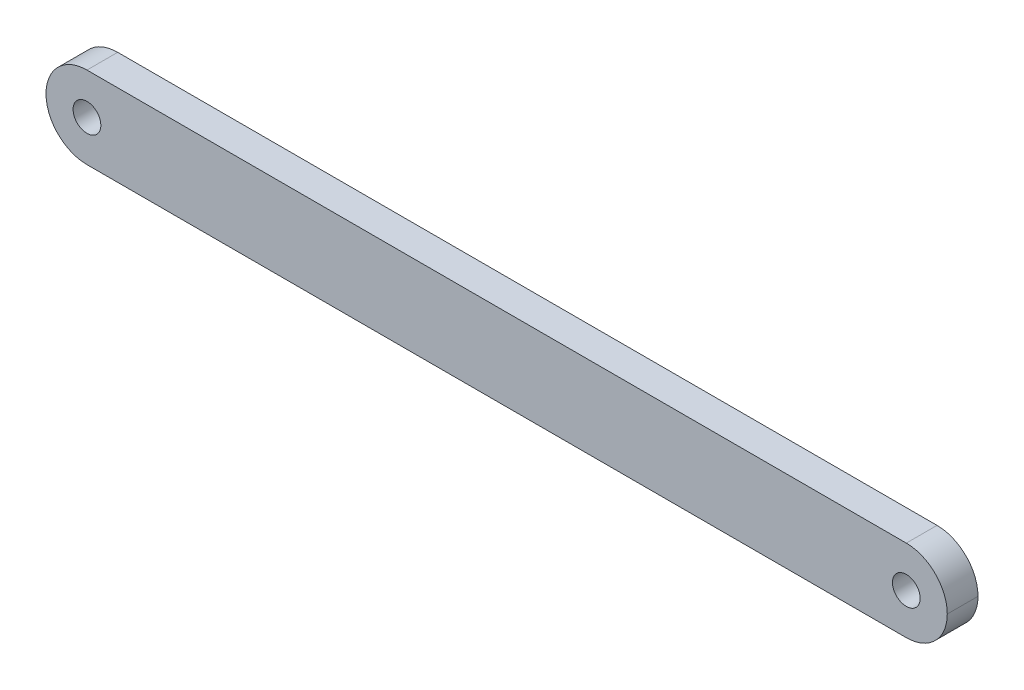
ISO-10303-21;
HEADER;
FILE_DESCRIPTION(('STEP AP214'),'2;1');
FILE_NAME('part.step','',(''),(''),'','','');
FILE_SCHEMA(('AUTOMOTIVE_DESIGN { 1 0 10303 214 1 1 1 1 }'));
ENDSEC;
DATA;
#1=APPLICATION_CONTEXT('core data for automotive mechanical design processes');
#2=APPLICATION_PROTOCOL_DEFINITION('international standard','automotive_design',2000,#1);
#3=PRODUCT_CONTEXT('',#1,'mechanical');
#4=PRODUCT('Part','Part','',(#3));
#5=PRODUCT_RELATED_PRODUCT_CATEGORY('part','',(#4));
#6=PRODUCT_DEFINITION_FORMATION('','',#4);
#7=PRODUCT_DEFINITION_CONTEXT('part definition',#1,'design');
#8=PRODUCT_DEFINITION('design','',#6,#7);
#9=PRODUCT_DEFINITION_SHAPE('','',#8);
#10=(LENGTH_UNIT() NAMED_UNIT(*) SI_UNIT(.MILLI.,.METRE.));
#11=(NAMED_UNIT(*) PLANE_ANGLE_UNIT() SI_UNIT($,.RADIAN.));
#12=(NAMED_UNIT(*) SI_UNIT($,.STERADIAN.) SOLID_ANGLE_UNIT());
#13=UNCERTAINTY_MEASURE_WITH_UNIT(LENGTH_MEASURE(1.E-05),#10,'distance_accuracy_value','');
#14=(GEOMETRIC_REPRESENTATION_CONTEXT(3) GLOBAL_UNCERTAINTY_ASSIGNED_CONTEXT((#13)) GLOBAL_UNIT_ASSIGNED_CONTEXT((#10,
#11,#12)) REPRESENTATION_CONTEXT('',''));
#15=CARTESIAN_POINT('',(0.,0.,0.));
#16=DIRECTION('',(0.,0.,1.));
#17=DIRECTION('',(1.,0.,0.));
#18=AXIS2_PLACEMENT_3D('',#15,#16,#17);
#19=CARTESIAN_POINT('',(55.8602220991314,3.999,3.));
#20=DIRECTION('',(0.,0.,-1.));
#21=DIRECTION('',(-1.,0.,0.));
#22=AXIS2_PLACEMENT_3D('',#19,#20,#21);
#23=CYLINDRICAL_SURFACE('',#22,4.);
#24=CARTESIAN_POINT('',(55.8602220991314,3.999,0.));
#25=DIRECTION('',(0.,0.,-1.));
#26=DIRECTION('',(-1.,0.,0.));
#27=AXIS2_PLACEMENT_3D('',#24,#25,#26);
#28=CIRCLE('',#27,4.);
#29=CARTESIAN_POINT('',(55.8602220991314,7.999,0.));
#30=VERTEX_POINT('',#29);
#31=CARTESIAN_POINT('',(59.8602219741314,3.99999999998902,0.));
#32=VERTEX_POINT('',#31);
#33=EDGE_CURVE('E122',#30,#32,#28,.T.);
#34=ORIENTED_EDGE('',*,*,#33,.F.);
#35=DIRECTION('',(0.,0.,-1.));
#36=VECTOR('',#35,1.);
#37=CARTESIAN_POINT('',(55.8602220991314,7.999,3.));
#38=LINE('',#37,#36);
#39=CARTESIAN_POINT('',(55.8602220991314,7.999,3.));
#40=VERTEX_POINT('',#39);
#41=EDGE_CURVE('E11',#40,#30,#38,.T.);
#42=ORIENTED_EDGE('',*,*,#41,.F.);
#43=CARTESIAN_POINT('',(55.8602220991314,3.999,3.));
#44=DIRECTION('',(0.,0.,-1.));
#45=DIRECTION('',(-1.,0.,0.));
#46=AXIS2_PLACEMENT_3D('',#43,#44,#45);
#47=CIRCLE('',#46,4.);
#48=CARTESIAN_POINT('',(59.8602219741314,3.99999999998902,3.));
#49=VERTEX_POINT('',#48);
#50=EDGE_CURVE('E137',#40,#49,#47,.T.);
#51=ORIENTED_EDGE('',*,*,#50,.T.);
#52=DIRECTION('',(0.,0.,-1.));
#53=VECTOR('',#52,1.);
#54=CARTESIAN_POINT('',(59.8602219741314,3.99999999998902,3.));
#55=LINE('',#54,#53);
#56=EDGE_CURVE('E40',#49,#32,#55,.T.);
#57=ORIENTED_EDGE('',*,*,#56,.T.);
#58=EDGE_LOOP('',(#34,#42,#51,#57));
#59=FACE_BOUND('',#58,.T.);
#60=ADVANCED_FACE('F37',(#59),#23,.T.);
#61=CARTESIAN_POINT('',(-24.1383205351164,7.999,3.));
#62=DIRECTION('',(0.,1.,0.));
#63=DIRECTION('',(0.,0.,1.));
#64=AXIS2_PLACEMENT_3D('',#61,#62,#63);
#65=PLANE('',#64);
#66=DIRECTION('',(1.,0.,0.));
#67=VECTOR('',#66,1.);
#68=CARTESIAN_POINT('',(-24.1383205351164,7.999,0.));
#69=LINE('',#68,#67);
#70=CARTESIAN_POINT('',(-24.1383205351164,7.999,0.));
#71=VERTEX_POINT('',#70);
#72=EDGE_CURVE('E135',#71,#30,#69,.T.);
#73=ORIENTED_EDGE('',*,*,#72,.F.);
#74=DIRECTION('',(0.,0.,-1.));
#75=VECTOR('',#74,1.);
#76=CARTESIAN_POINT('',(-24.1383205351164,7.999,3.));
#77=LINE('',#76,#75);
#78=CARTESIAN_POINT('',(-24.1383205351164,7.999,3.));
#79=VERTEX_POINT('',#78);
#80=EDGE_CURVE('E46',#79,#71,#77,.T.);
#81=ORIENTED_EDGE('',*,*,#80,.F.);
#82=DIRECTION('',(1.,0.,0.));
#83=VECTOR('',#82,1.);
#84=CARTESIAN_POINT('',(-24.1383205351164,7.999,3.));
#85=LINE('',#84,#83);
#86=EDGE_CURVE('E112',#79,#40,#85,.T.);
#87=ORIENTED_EDGE('',*,*,#86,.T.);
#88=ORIENTED_EDGE('',*,*,#41,.T.);
#89=EDGE_LOOP('',(#73,#81,#87,#88));
#90=FACE_BOUND('',#89,.T.);
#91=ADVANCED_FACE('F145',(#90),#65,.T.);
#92=CARTESIAN_POINT('',(-24.1383205351164,3.999,3.));
#93=DIRECTION('',(0.,0.,-1.));
#94=DIRECTION('',(-1.,0.,0.));
#95=AXIS2_PLACEMENT_3D('',#92,#93,#94);
#96=CYLINDRICAL_SURFACE('',#95,4.);
#97=CARTESIAN_POINT('',(-24.1383205351164,3.999,0.));
#98=DIRECTION('',(0.,0.,-1.));
#99=DIRECTION('',(-1.,0.,0.));
#100=AXIS2_PLACEMENT_3D('',#97,#98,#99);
#101=CIRCLE('',#100,4.);
#102=CARTESIAN_POINT('',(-28.1383205351164,3.99900000000404,0.));
#103=VERTEX_POINT('',#102);
#104=EDGE_CURVE('E99',#103,#71,#101,.T.);
#105=ORIENTED_EDGE('',*,*,#104,.F.);
#106=DIRECTION('',(0.,0.,-1.));
#107=VECTOR('',#106,1.);
#108=CARTESIAN_POINT('',(-28.1383205351164,3.99900000000404,3.));
#109=LINE('',#108,#107);
#110=CARTESIAN_POINT('',(-28.1383205351164,3.99900000000404,3.));
#111=VERTEX_POINT('',#110);
#112=EDGE_CURVE('E94',#111,#103,#109,.T.);
#113=ORIENTED_EDGE('',*,*,#112,.F.);
#114=CARTESIAN_POINT('',(-24.1383205351164,3.999,3.));
#115=DIRECTION('',(0.,0.,-1.));
#116=DIRECTION('',(-1.,0.,0.));
#117=AXIS2_PLACEMENT_3D('',#114,#115,#116);
#118=CIRCLE('',#117,4.);
#119=EDGE_CURVE('E97',#111,#79,#118,.T.);
#120=ORIENTED_EDGE('',*,*,#119,.T.);
#121=ORIENTED_EDGE('',*,*,#80,.T.);
#122=EDGE_LOOP('',(#105,#113,#120,#121));
#123=FACE_BOUND('',#122,.T.);
#124=ADVANCED_FACE('F96',(#123),#96,.T.);
#125=CARTESIAN_POINT('',(-24.1383206601164,4.,3.));
#126=DIRECTION('',(0.,0.,-1.));
#127=DIRECTION('',(-1.,0.,0.));
#128=AXIS2_PLACEMENT_3D('',#125,#126,#127);
#129=CYLINDRICAL_SURFACE('',#128,4.);
#130=CARTESIAN_POINT('',(-24.1383206601164,4.,0.));
#131=DIRECTION('',(0.,0.,-1.));
#132=DIRECTION('',(-1.,0.,0.));
#133=AXIS2_PLACEMENT_3D('',#130,#131,#132);
#134=CIRCLE('',#133,4.);
#135=CARTESIAN_POINT('',(-24.1383206601164,0.,0.));
#136=VERTEX_POINT('',#135);
#137=EDGE_CURVE('E132',#136,#103,#134,.T.);
#138=ORIENTED_EDGE('',*,*,#137,.F.);
#139=DIRECTION('',(0.,0.,-1.));
#140=VECTOR('',#139,1.);
#141=CARTESIAN_POINT('',(-24.1383206601164,0.,3.));
#142=LINE('',#141,#140);
#143=CARTESIAN_POINT('',(-24.1383206601164,0.,3.));
#144=VERTEX_POINT('',#143);
#145=EDGE_CURVE('E104',#144,#136,#142,.T.);
#146=ORIENTED_EDGE('',*,*,#145,.F.);
#147=CARTESIAN_POINT('',(-24.1383206601164,4.,3.));
#148=DIRECTION('',(0.,0.,-1.));
#149=DIRECTION('',(-1.,0.,0.));
#150=AXIS2_PLACEMENT_3D('',#147,#148,#149);
#151=CIRCLE('',#150,4.);
#152=EDGE_CURVE('E110',#144,#111,#151,.T.);
#153=ORIENTED_EDGE('',*,*,#152,.T.);
#154=ORIENTED_EDGE('',*,*,#112,.T.);
#155=EDGE_LOOP('',(#138,#146,#153,#154));
#156=FACE_BOUND('',#155,.T.);
#157=ADVANCED_FACE('F114',(#156),#129,.T.);
#158=CARTESIAN_POINT('',(55.8602219741314,0.,3.));
#159=DIRECTION('',(0.,-1.,0.));
#160=DIRECTION('',(0.,0.,-1.));
#161=AXIS2_PLACEMENT_3D('',#158,#159,#160);
#162=PLANE('',#161);
#163=DIRECTION('',(-1.,0.,0.));
#164=VECTOR('',#163,1.);
#165=CARTESIAN_POINT('',(55.8602219741314,0.,0.));
#166=LINE('',#165,#164);
#167=CARTESIAN_POINT('',(55.8602219741314,0.,0.));
#168=VERTEX_POINT('',#167);
#169=EDGE_CURVE('E129',#168,#136,#166,.T.);
#170=ORIENTED_EDGE('',*,*,#169,.F.);
#171=DIRECTION('',(0.,0.,-1.));
#172=VECTOR('',#171,1.);
#173=CARTESIAN_POINT('',(55.8602219741314,0.,3.));
#174=LINE('',#173,#172);
#175=CARTESIAN_POINT('',(55.8602219741314,0.,3.));
#176=VERTEX_POINT('',#175);
#177=EDGE_CURVE('E140',#176,#168,#174,.T.);
#178=ORIENTED_EDGE('',*,*,#177,.F.);
#179=DIRECTION('',(-1.,0.,0.));
#180=VECTOR('',#179,1.);
#181=CARTESIAN_POINT('',(55.8602219741314,0.,3.));
#182=LINE('',#181,#180);
#183=EDGE_CURVE('E115',#176,#144,#182,.T.);
#184=ORIENTED_EDGE('',*,*,#183,.T.);
#185=ORIENTED_EDGE('',*,*,#145,.T.);
#186=EDGE_LOOP('',(#170,#178,#184,#185));
#187=FACE_BOUND('',#186,.T.);
#188=ADVANCED_FACE('F158',(#187),#162,.T.);
#189=CARTESIAN_POINT('',(55.8602219741314,4.,3.));
#190=DIRECTION('',(0.,0.,-1.));
#191=DIRECTION('',(-1.,0.,0.));
#192=AXIS2_PLACEMENT_3D('',#189,#190,#191);
#193=CYLINDRICAL_SURFACE('',#192,4.);
#194=CARTESIAN_POINT('',(55.8602219741314,4.,0.));
#195=DIRECTION('',(0.,0.,-1.));
#196=DIRECTION('',(-1.,0.,0.));
#197=AXIS2_PLACEMENT_3D('',#194,#195,#196);
#198=CIRCLE('',#197,4.);
#199=EDGE_CURVE('E125',#32,#168,#198,.T.);
#200=ORIENTED_EDGE('',*,*,#199,.F.);
#201=ORIENTED_EDGE('',*,*,#56,.F.);
#202=CARTESIAN_POINT('',(55.8602219741314,4.,3.));
#203=DIRECTION('',(0.,0.,-1.));
#204=DIRECTION('',(-1.,0.,0.));
#205=AXIS2_PLACEMENT_3D('',#202,#203,#204);
#206=CIRCLE('',#205,4.);
#207=EDGE_CURVE('E117',#49,#176,#206,.T.);
#208=ORIENTED_EDGE('',*,*,#207,.T.);
#209=ORIENTED_EDGE('',*,*,#177,.T.);
#210=EDGE_LOOP('',(#200,#201,#208,#209));
#211=FACE_BOUND('',#210,.T.);
#212=ADVANCED_FACE('F142',(#211),#193,.T.);
#213=CARTESIAN_POINT('',(55.8602220991314,3.999,3.));
#214=DIRECTION('',(0.,0.,-1.));
#215=DIRECTION('',(-1.,0.,0.));
#216=AXIS2_PLACEMENT_3D('',#213,#214,#215);
#217=PLANE('',#216);
#218=CARTESIAN_POINT('',(55.8597335084298,3.99951153429841,3.));
#219=DIRECTION('',(0.,0.,-1.));
#220=DIRECTION('',(1.,0.,0.));
#221=AXIS2_PLACEMENT_3D('',#218,#219,#220);
#222=CIRCLE('',#221,1.35401050244143);
#223=CARTESIAN_POINT('',(54.5057230059884,3.99951153429841,3.));
#224=VERTEX_POINT('',#223);
#225=EDGE_CURVE('E184',#224,#224,#222,.T.);
#226=ORIENTED_EDGE('',*,*,#225,.T.);
#227=EDGE_LOOP('',(#226));
#228=FACE_BOUND('',#227,.T.);
#229=CARTESIAN_POINT('',(-24.138809000818,3.99851153429842,3.));
#230=DIRECTION('',(0.,0.,-1.));
#231=DIRECTION('',(1.,0.,0.));
#232=AXIS2_PLACEMENT_3D('',#229,#230,#231);
#233=CIRCLE('',#232,1.35401050244143);
#234=CARTESIAN_POINT('',(-25.4928195032594,3.99851153429842,3.));
#235=VERTEX_POINT('',#234);
#236=EDGE_CURVE('E126',#235,#235,#233,.T.);
#237=ORIENTED_EDGE('',*,*,#236,.T.);
#238=EDGE_LOOP('',(#237));
#239=FACE_BOUND('',#238,.T.);
#240=ORIENTED_EDGE('',*,*,#50,.F.);
#241=ORIENTED_EDGE('',*,*,#86,.F.);
#242=ORIENTED_EDGE('',*,*,#119,.F.);
#243=ORIENTED_EDGE('',*,*,#152,.F.);
#244=ORIENTED_EDGE('',*,*,#183,.F.);
#245=ORIENTED_EDGE('',*,*,#207,.F.);
#246=EDGE_LOOP('',(#240,#241,#242,#243,#244,#245));
#247=FACE_BOUND('',#246,.T.);
#248=ADVANCED_FACE('F108',(#228,#239,#247),#217,.F.);
#249=CARTESIAN_POINT('',(55.8602220991314,3.999,0.));
#250=DIRECTION('',(0.,0.,-1.));
#251=DIRECTION('',(-1.,0.,0.));
#252=AXIS2_PLACEMENT_3D('',#249,#250,#251);
#253=PLANE('',#252);
#254=CARTESIAN_POINT('',(55.8597335084298,3.99951153429841,0.));
#255=DIRECTION('',(0.,0.,-1.));
#256=DIRECTION('',(1.,0.,0.));
#257=AXIS2_PLACEMENT_3D('',#254,#255,#256);
#258=CIRCLE('',#257,1.35401050244143);
#259=CARTESIAN_POINT('',(54.5057230059884,3.99951153429841,0.));
#260=VERTEX_POINT('',#259);
#261=EDGE_CURVE('E187',#260,#260,#258,.T.);
#262=ORIENTED_EDGE('',*,*,#261,.F.);
#263=EDGE_LOOP('',(#262));
#264=FACE_BOUND('',#263,.T.);
#265=CARTESIAN_POINT('',(-24.138809000818,3.99851153429842,0.));
#266=DIRECTION('',(0.,0.,-1.));
#267=DIRECTION('',(1.,0.,0.));
#268=AXIS2_PLACEMENT_3D('',#265,#266,#267);
#269=CIRCLE('',#268,1.35401050244143);
#270=CARTESIAN_POINT('',(-25.4928195032594,3.99851153429842,0.));
#271=VERTEX_POINT('',#270);
#272=EDGE_CURVE('E189',#271,#271,#269,.T.);
#273=ORIENTED_EDGE('',*,*,#272,.F.);
#274=EDGE_LOOP('',(#273));
#275=FACE_BOUND('',#274,.T.);
#276=ORIENTED_EDGE('',*,*,#33,.T.);
#277=ORIENTED_EDGE('',*,*,#199,.T.);
#278=ORIENTED_EDGE('',*,*,#169,.T.);
#279=ORIENTED_EDGE('',*,*,#137,.T.);
#280=ORIENTED_EDGE('',*,*,#104,.T.);
#281=ORIENTED_EDGE('',*,*,#72,.T.);
#282=EDGE_LOOP('',(#276,#277,#278,#279,#280,#281));
#283=FACE_BOUND('',#282,.T.);
#284=ADVANCED_FACE('F144',(#264,#275,#283),#253,.T.);
#285=CARTESIAN_POINT('',(-24.138809000818,3.99851153429842,3.));
#286=DIRECTION('',(0.,0.,-1.));
#287=DIRECTION('',(-1.,0.,0.));
#288=AXIS2_PLACEMENT_3D('',#285,#286,#287);
#289=CYLINDRICAL_SURFACE('',#288,1.35401050244143);
#290=CARTESIAN_POINT('',(-25.4928195032594,3.99851153429842,3.));
#291=CARTESIAN_POINT('',(-25.4928195032594,3.99851153429842,2.96875));
#292=CARTESIAN_POINT('',(-25.4928195032594,3.99851153429842,2.9375));
#293=CARTESIAN_POINT('',(-25.4928195032594,3.99851153429842,2.875));
#294=CARTESIAN_POINT('',(-25.4928195032594,3.99851153429842,2.84375));
#295=CARTESIAN_POINT('',(-25.4928195032594,3.99851153429842,2.78125));
#296=CARTESIAN_POINT('',(-25.4928195032594,3.99851153429842,2.75));
#297=CARTESIAN_POINT('',(-25.4928195032594,3.99851153429842,2.6875));
#298=CARTESIAN_POINT('',(-25.4928195032594,3.99851153429842,2.65625));
#299=CARTESIAN_POINT('',(-25.4928195032594,3.99851153429842,2.59375));
#300=CARTESIAN_POINT('',(-25.4928195032594,3.99851153429842,2.5625));
#301=CARTESIAN_POINT('',(-25.4928195032594,3.99851153429842,2.5));
#302=CARTESIAN_POINT('',(-25.4928195032594,3.99851153429842,2.46875));
#303=CARTESIAN_POINT('',(-25.4928195032594,3.99851153429842,2.40625));
#304=CARTESIAN_POINT('',(-25.4928195032594,3.99851153429842,2.375));
#305=CARTESIAN_POINT('',(-25.4928195032594,3.99851153429842,2.3125));
#306=CARTESIAN_POINT('',(-25.4928195032594,3.99851153429842,2.28125));
#307=CARTESIAN_POINT('',(-25.4928195032594,3.99851153429842,2.21875));
#308=CARTESIAN_POINT('',(-25.4928195032594,3.99851153429842,2.1875));
#309=CARTESIAN_POINT('',(-25.4928195032594,3.99851153429842,2.125));
#310=CARTESIAN_POINT('',(-25.4928195032594,3.99851153429842,2.09375));
#311=CARTESIAN_POINT('',(-25.4928195032594,3.99851153429842,2.03125));
#312=CARTESIAN_POINT('',(-25.4928195032594,3.99851153429842,2.));
#313=CARTESIAN_POINT('',(-25.4928195032594,3.99851153429842,1.9375));
#314=CARTESIAN_POINT('',(-25.4928195032594,3.99851153429842,1.90625));
#315=CARTESIAN_POINT('',(-25.4928195032594,3.99851153429842,1.84375));
#316=CARTESIAN_POINT('',(-25.4928195032594,3.99851153429842,1.8125));
#317=CARTESIAN_POINT('',(-25.4928195032594,3.99851153429842,1.75));
#318=CARTESIAN_POINT('',(-25.4928195032594,3.99851153429842,1.71875));
#319=CARTESIAN_POINT('',(-25.4928195032594,3.99851153429842,1.65625));
#320=CARTESIAN_POINT('',(-25.4928195032594,3.99851153429842,1.625));
#321=CARTESIAN_POINT('',(-25.4928195032594,3.99851153429842,1.5625));
#322=CARTESIAN_POINT('',(-25.4928195032594,3.99851153429842,1.53125));
#323=CARTESIAN_POINT('',(-25.4928195032594,3.99851153429842,1.46875));
#324=CARTESIAN_POINT('',(-25.4928195032594,3.99851153429842,1.4375));
#325=CARTESIAN_POINT('',(-25.4928195032594,3.99851153429842,1.375));
#326=CARTESIAN_POINT('',(-25.4928195032594,3.99851153429842,1.34375));
#327=CARTESIAN_POINT('',(-25.4928195032594,3.99851153429842,1.28125));
#328=CARTESIAN_POINT('',(-25.4928195032594,3.99851153429842,1.25));
#329=CARTESIAN_POINT('',(-25.4928195032594,3.99851153429842,1.1875));
#330=CARTESIAN_POINT('',(-25.4928195032594,3.99851153429842,1.15625));
#331=CARTESIAN_POINT('',(-25.4928195032594,3.99851153429842,1.09375));
#332=CARTESIAN_POINT('',(-25.4928195032594,3.99851153429842,1.0625));
#333=CARTESIAN_POINT('',(-25.4928195032594,3.99851153429842,1.));
#334=CARTESIAN_POINT('',(-25.4928195032594,3.99851153429842,0.96875));
#335=CARTESIAN_POINT('',(-25.4928195032594,3.99851153429842,0.90625));
#336=CARTESIAN_POINT('',(-25.4928195032594,3.99851153429842,0.875));
#337=CARTESIAN_POINT('',(-25.4928195032594,3.99851153429842,0.8125));
#338=CARTESIAN_POINT('',(-25.4928195032594,3.99851153429842,0.78125));
#339=CARTESIAN_POINT('',(-25.4928195032594,3.99851153429842,0.71875));
#340=CARTESIAN_POINT('',(-25.4928195032594,3.99851153429842,0.6875));
#341=CARTESIAN_POINT('',(-25.4928195032594,3.99851153429842,0.625));
#342=CARTESIAN_POINT('',(-25.4928195032594,3.99851153429842,0.59375));
#343=CARTESIAN_POINT('',(-25.4928195032594,3.99851153429842,0.53125));
#344=CARTESIAN_POINT('',(-25.4928195032594,3.99851153429842,0.5));
#345=CARTESIAN_POINT('',(-25.4928195032594,3.99851153429842,0.4375));
#346=CARTESIAN_POINT('',(-25.4928195032594,3.99851153429842,0.40625));
#347=CARTESIAN_POINT('',(-25.4928195032594,3.99851153429842,0.34375));
#348=CARTESIAN_POINT('',(-25.4928195032594,3.99851153429842,0.3125));
#349=CARTESIAN_POINT('',(-25.4928195032594,3.99851153429842,0.25));
#350=CARTESIAN_POINT('',(-25.4928195032594,3.99851153429842,0.21875));
#351=CARTESIAN_POINT('',(-25.4928195032594,3.99851153429842,0.15625));
#352=CARTESIAN_POINT('',(-25.4928195032594,3.99851153429842,0.125));
#353=CARTESIAN_POINT('',(-25.4928195032594,3.99851153429842,0.0625000000000001));
#354=CARTESIAN_POINT('',(-25.4928195032594,3.99851153429842,0.03125));
#355=CARTESIAN_POINT('',(-25.4928195032594,3.99851153429842,0.));
#356=B_SPLINE_CURVE_WITH_KNOTS('',3,(#290,#291,#292,#293,#294,#295,#296,#297,#298,#299,#300,
#301,#302,#303,#304,#305,#306,#307,#308,#309,#310,#311,#312,#313,#314,#315,#316,#317,#318,#319,
#320,#321,#322,#323,#324,#325,#326,#327,#328,#329,#330,#331,#332,#333,#334,#335,#336,#337,#338,
#339,#340,#341,#342,#343,#344,#345,#346,#347,#348,#349,#350,#351,#352,#353,#354,#355),
.UNSPECIFIED.,.F.,.F.,(4,2,2,2,2,2,2,2,2,2,2,2,2,2,2,2,2,2,2,2,2,2,2,2,2,2,2,2,2,2,2,2,4),(0.,
0.0937500000000001,0.1875,0.28125,0.375,0.46875,0.5625,0.656250000000001,0.750000000000001,
0.843750000000001,0.9375,1.03125,1.125,1.21875,1.3125,1.40625,1.5,1.59375,1.6875,1.78125,1.875,
1.96875,2.0625,2.15625,2.25,2.34375,2.4375,2.53125,2.625,2.71875,2.8125,2.90625,3.),.UNSPECIFIED.);
#357=EDGE_CURVE('BSEAM169',#235,#271,#356,.T.);
#358=ORIENTED_EDGE('',*,*,#236,.F.);
#359=ORIENTED_EDGE('',*,*,#272,.T.);
#360=ORIENTED_EDGE('',*,*,#357,.T.);
#361=ORIENTED_EDGE('',*,*,#357,.F.);
#362=EDGE_LOOP('',(#358,#360,#359,#361));
#363=FACE_BOUND('',#362,.T.);
#364=ADVANCED_FACE('F169',(#363),#289,.F.);
#365=CARTESIAN_POINT('',(55.8597335084298,3.99951153429841,3.));
#366=DIRECTION('',(0.,0.,-1.));
#367=DIRECTION('',(-1.,0.,0.));
#368=AXIS2_PLACEMENT_3D('',#365,#366,#367);
#369=CYLINDRICAL_SURFACE('',#368,1.35401050244143);
#370=CARTESIAN_POINT('',(54.5057230059884,3.99951153429841,3.));
#371=CARTESIAN_POINT('',(54.5057230059884,3.99951153429841,2.96875));
#372=CARTESIAN_POINT('',(54.5057230059884,3.99951153429841,2.9375));
#373=CARTESIAN_POINT('',(54.5057230059884,3.99951153429841,2.875));
#374=CARTESIAN_POINT('',(54.5057230059884,3.99951153429841,2.84375));
#375=CARTESIAN_POINT('',(54.5057230059884,3.99951153429841,2.78125));
#376=CARTESIAN_POINT('',(54.5057230059884,3.99951153429841,2.75));
#377=CARTESIAN_POINT('',(54.5057230059884,3.99951153429841,2.6875));
#378=CARTESIAN_POINT('',(54.5057230059884,3.99951153429841,2.65625));
#379=CARTESIAN_POINT('',(54.5057230059884,3.99951153429841,2.59375));
#380=CARTESIAN_POINT('',(54.5057230059884,3.99951153429841,2.5625));
#381=CARTESIAN_POINT('',(54.5057230059884,3.99951153429841,2.5));
#382=CARTESIAN_POINT('',(54.5057230059884,3.99951153429841,2.46875));
#383=CARTESIAN_POINT('',(54.5057230059884,3.99951153429841,2.40625));
#384=CARTESIAN_POINT('',(54.5057230059884,3.99951153429841,2.375));
#385=CARTESIAN_POINT('',(54.5057230059884,3.99951153429841,2.3125));
#386=CARTESIAN_POINT('',(54.5057230059884,3.99951153429841,2.28125));
#387=CARTESIAN_POINT('',(54.5057230059884,3.99951153429841,2.21875));
#388=CARTESIAN_POINT('',(54.5057230059884,3.99951153429841,2.1875));
#389=CARTESIAN_POINT('',(54.5057230059884,3.99951153429841,2.125));
#390=CARTESIAN_POINT('',(54.5057230059884,3.99951153429841,2.09375));
#391=CARTESIAN_POINT('',(54.5057230059884,3.99951153429841,2.03125));
#392=CARTESIAN_POINT('',(54.5057230059884,3.99951153429841,2.));
#393=CARTESIAN_POINT('',(54.5057230059884,3.99951153429841,1.9375));
#394=CARTESIAN_POINT('',(54.5057230059884,3.99951153429841,1.90625));
#395=CARTESIAN_POINT('',(54.5057230059884,3.99951153429841,1.84375));
#396=CARTESIAN_POINT('',(54.5057230059884,3.99951153429841,1.8125));
#397=CARTESIAN_POINT('',(54.5057230059884,3.99951153429841,1.75));
#398=CARTESIAN_POINT('',(54.5057230059884,3.99951153429841,1.71875));
#399=CARTESIAN_POINT('',(54.5057230059884,3.99951153429841,1.65625));
#400=CARTESIAN_POINT('',(54.5057230059884,3.99951153429841,1.625));
#401=CARTESIAN_POINT('',(54.5057230059884,3.99951153429841,1.5625));
#402=CARTESIAN_POINT('',(54.5057230059884,3.99951153429841,1.53125));
#403=CARTESIAN_POINT('',(54.5057230059884,3.99951153429841,1.46875));
#404=CARTESIAN_POINT('',(54.5057230059884,3.99951153429841,1.4375));
#405=CARTESIAN_POINT('',(54.5057230059884,3.99951153429841,1.375));
#406=CARTESIAN_POINT('',(54.5057230059884,3.99951153429841,1.34375));
#407=CARTESIAN_POINT('',(54.5057230059884,3.99951153429841,1.28125));
#408=CARTESIAN_POINT('',(54.5057230059884,3.99951153429841,1.25));
#409=CARTESIAN_POINT('',(54.5057230059884,3.99951153429841,1.1875));
#410=CARTESIAN_POINT('',(54.5057230059884,3.99951153429841,1.15625));
#411=CARTESIAN_POINT('',(54.5057230059884,3.99951153429841,1.09375));
#412=CARTESIAN_POINT('',(54.5057230059884,3.99951153429841,1.0625));
#413=CARTESIAN_POINT('',(54.5057230059884,3.99951153429841,1.));
#414=CARTESIAN_POINT('',(54.5057230059884,3.99951153429841,0.96875));
#415=CARTESIAN_POINT('',(54.5057230059884,3.99951153429841,0.90625));
#416=CARTESIAN_POINT('',(54.5057230059884,3.99951153429841,0.875));
#417=CARTESIAN_POINT('',(54.5057230059884,3.99951153429841,0.8125));
#418=CARTESIAN_POINT('',(54.5057230059884,3.99951153429841,0.78125));
#419=CARTESIAN_POINT('',(54.5057230059884,3.99951153429841,0.71875));
#420=CARTESIAN_POINT('',(54.5057230059884,3.99951153429841,0.6875));
#421=CARTESIAN_POINT('',(54.5057230059884,3.99951153429841,0.625));
#422=CARTESIAN_POINT('',(54.5057230059884,3.99951153429841,0.59375));
#423=CARTESIAN_POINT('',(54.5057230059884,3.99951153429841,0.53125));
#424=CARTESIAN_POINT('',(54.5057230059884,3.99951153429841,0.5));
#425=CARTESIAN_POINT('',(54.5057230059884,3.99951153429841,0.4375));
#426=CARTESIAN_POINT('',(54.5057230059884,3.99951153429841,0.40625));
#427=CARTESIAN_POINT('',(54.5057230059884,3.99951153429841,0.34375));
#428=CARTESIAN_POINT('',(54.5057230059884,3.99951153429841,0.3125));
#429=CARTESIAN_POINT('',(54.5057230059884,3.99951153429841,0.25));
#430=CARTESIAN_POINT('',(54.5057230059884,3.99951153429841,0.21875));
#431=CARTESIAN_POINT('',(54.5057230059884,3.99951153429841,0.15625));
#432=CARTESIAN_POINT('',(54.5057230059884,3.99951153429841,0.125));
#433=CARTESIAN_POINT('',(54.5057230059884,3.99951153429841,0.0625000000000001));
#434=CARTESIAN_POINT('',(54.5057230059884,3.99951153429841,0.03125));
#435=CARTESIAN_POINT('',(54.5057230059884,3.99951153429841,0.));
#436=B_SPLINE_CURVE_WITH_KNOTS('',3,(#370,#371,#372,#373,#374,#375,#376,#377,#378,#379,#380,
#381,#382,#383,#384,#385,#386,#387,#388,#389,#390,#391,#392,#393,#394,#395,#396,#397,#398,#399,
#400,#401,#402,#403,#404,#405,#406,#407,#408,#409,#410,#411,#412,#413,#414,#415,#416,#417,#418,
#419,#420,#421,#422,#423,#424,#425,#426,#427,#428,#429,#430,#431,#432,#433,#434,#435),
.UNSPECIFIED.,.F.,.F.,(4,2,2,2,2,2,2,2,2,2,2,2,2,2,2,2,2,2,2,2,2,2,2,2,2,2,2,2,2,2,2,2,4),(0.,
0.0937500000000001,0.1875,0.28125,0.375,0.46875,0.5625,0.656250000000001,0.750000000000001,
0.843750000000001,0.9375,1.03125,1.125,1.21875,1.3125,1.40625,1.5,1.59375,1.6875,1.78125,1.875,
1.96875,2.0625,2.15625,2.25,2.34375,2.4375,2.53125,2.625,2.71875,2.8125,2.90625,3.),.UNSPECIFIED.);
#437=EDGE_CURVE('BSEAM176',#224,#260,#436,.T.);
#438=ORIENTED_EDGE('',*,*,#225,.F.);
#439=ORIENTED_EDGE('',*,*,#261,.T.);
#440=ORIENTED_EDGE('',*,*,#437,.T.);
#441=ORIENTED_EDGE('',*,*,#437,.F.);
#442=EDGE_LOOP('',(#438,#440,#439,#441));
#443=FACE_BOUND('',#442,.T.);
#444=ADVANCED_FACE('F176',(#443),#369,.F.);
#445=CLOSED_SHELL('',(#60,#91,#124,#157,#188,#212,#248,#284,#364,#444));
#446=MANIFOLD_SOLID_BREP('B2',#445);
#447=ADVANCED_BREP_SHAPE_REPRESENTATION('',(#18,#446),#14);
#448=SHAPE_DEFINITION_REPRESENTATION(#9,#447);
ENDSEC;
END-ISO-10303-21;
